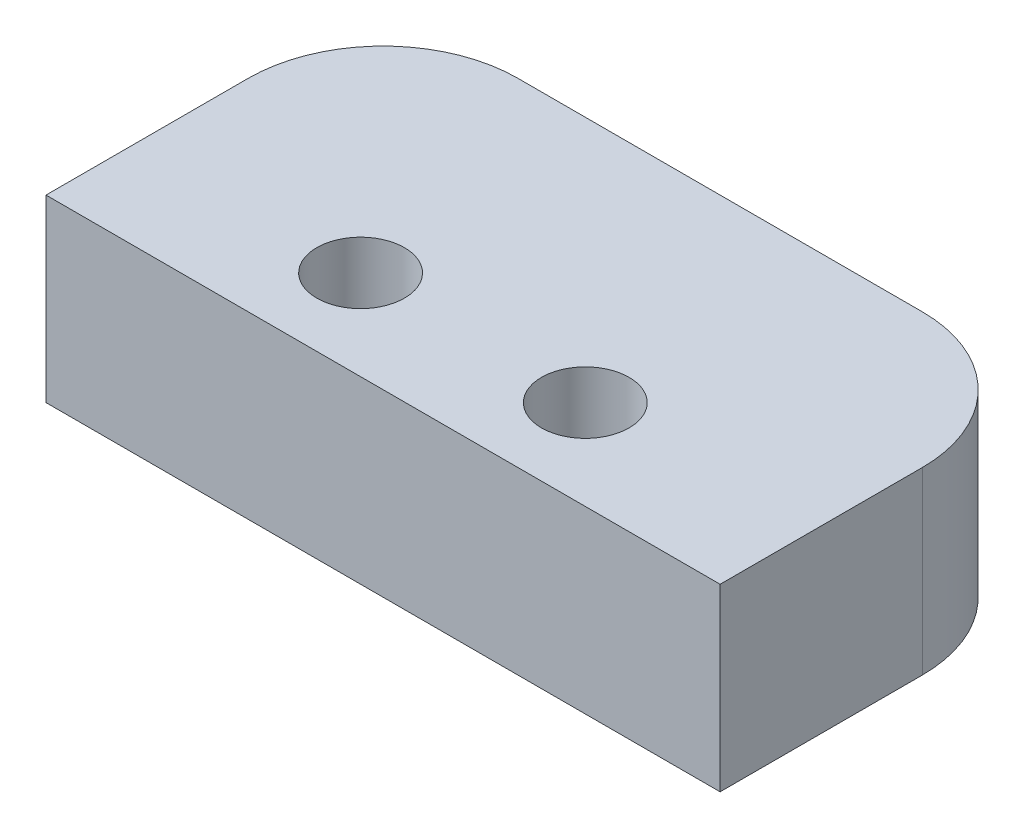
ISO-10303-21;
HEADER;
FILE_DESCRIPTION(('STEP AP214'),'2;1');
FILE_NAME('part.step','',(''),(''),'','','');
FILE_SCHEMA(('AUTOMOTIVE_DESIGN { 1 0 10303 214 1 1 1 1 }'));
ENDSEC;
DATA;
#1=APPLICATION_CONTEXT('core data for automotive mechanical design processes');
#2=APPLICATION_PROTOCOL_DEFINITION('international standard','automotive_design',2000,#1);
#3=PRODUCT_CONTEXT('',#1,'mechanical');
#4=PRODUCT('Part','Part','',(#3));
#5=PRODUCT_RELATED_PRODUCT_CATEGORY('part','',(#4));
#6=PRODUCT_DEFINITION_FORMATION('','',#4);
#7=PRODUCT_DEFINITION_CONTEXT('part definition',#1,'design');
#8=PRODUCT_DEFINITION('design','',#6,#7);
#9=PRODUCT_DEFINITION_SHAPE('','',#8);
#10=(LENGTH_UNIT() NAMED_UNIT(*) SI_UNIT(.MILLI.,.METRE.));
#11=(NAMED_UNIT(*) PLANE_ANGLE_UNIT() SI_UNIT($,.RADIAN.));
#12=(NAMED_UNIT(*) SI_UNIT($,.STERADIAN.) SOLID_ANGLE_UNIT());
#13=UNCERTAINTY_MEASURE_WITH_UNIT(LENGTH_MEASURE(1.E-05),#10,'distance_accuracy_value','');
#14=(GEOMETRIC_REPRESENTATION_CONTEXT(3) GLOBAL_UNCERTAINTY_ASSIGNED_CONTEXT((#13)) GLOBAL_UNIT_ASSIGNED_CONTEXT((#10,
#11,#12)) REPRESENTATION_CONTEXT('',''));
#15=CARTESIAN_POINT('',(0.,0.,0.));
#16=DIRECTION('',(0.,0.,1.));
#17=DIRECTION('',(1.,0.,0.));
#18=AXIS2_PLACEMENT_3D('',#15,#16,#17);
#19=CARTESIAN_POINT('',(-15.,8.,7.5));
#20=DIRECTION('',(1.,0.,0.));
#21=DIRECTION('',(0.,0.,-1.));
#22=AXIS2_PLACEMENT_3D('',#19,#20,#21);
#23=PLANE('',#22);
#24=DIRECTION('',(0.,0.,1.));
#25=VECTOR('',#24,1.);
#26=CARTESIAN_POINT('',(-15.,8.,7.5));
#27=LINE('',#26,#25);
#28=CARTESIAN_POINT('',(-15.,8.,-1.5));
#29=VERTEX_POINT('',#28);
#30=CARTESIAN_POINT('',(-15.,8.,7.5));
#31=VERTEX_POINT('',#30);
#32=EDGE_CURVE('E87',#29,#31,#27,.T.);
#33=ORIENTED_EDGE('',*,*,#32,.F.);
#34=DIRECTION('',(0.,-1.,0.));
#35=VECTOR('',#34,1.);
#36=CARTESIAN_POINT('',(-15.,8.,-1.5));
#37=LINE('',#36,#35);
#38=CARTESIAN_POINT('',(-15.,0.,-1.5));
#39=VERTEX_POINT('',#38);
#40=EDGE_CURVE('E110',#29,#39,#37,.T.);
#41=ORIENTED_EDGE('',*,*,#40,.T.);
#42=DIRECTION('',(0.,0.,1.));
#43=VECTOR('',#42,1.);
#44=CARTESIAN_POINT('',(-15.,0.,7.5));
#45=LINE('',#44,#43);
#46=CARTESIAN_POINT('',(-15.,0.,7.5));
#47=VERTEX_POINT('',#46);
#48=EDGE_CURVE('E108',#39,#47,#45,.T.);
#49=ORIENTED_EDGE('',*,*,#48,.T.);
#50=DIRECTION('',(0.,-1.,0.));
#51=VECTOR('',#50,1.);
#52=CARTESIAN_POINT('',(-15.,8.,7.5));
#53=LINE('',#52,#51);
#54=EDGE_CURVE('E102',#31,#47,#53,.T.);
#55=ORIENTED_EDGE('',*,*,#54,.F.);
#56=EDGE_LOOP('',(#33,#41,#49,#55));
#57=FACE_BOUND('',#56,.T.);
#58=ADVANCED_FACE('F33',(#57),#23,.F.);
#59=CARTESIAN_POINT('',(15.,8.,7.5));
#60=DIRECTION('',(0.,0.,-1.));
#61=DIRECTION('',(-1.,0.,0.));
#62=AXIS2_PLACEMENT_3D('',#59,#60,#61);
#63=PLANE('',#62);
#64=DIRECTION('',(1.,0.,0.));
#65=VECTOR('',#64,1.);
#66=CARTESIAN_POINT('',(15.,0.,7.5));
#67=LINE('',#66,#65);
#68=CARTESIAN_POINT('',(15.,0.,7.5));
#69=VERTEX_POINT('',#68);
#70=EDGE_CURVE('E137',#47,#69,#67,.T.);
#71=ORIENTED_EDGE('',*,*,#70,.T.);
#72=DIRECTION('',(0.,-1.,0.));
#73=VECTOR('',#72,1.);
#74=CARTESIAN_POINT('',(15.,8.,7.5));
#75=LINE('',#74,#73);
#76=CARTESIAN_POINT('',(15.,8.,7.5));
#77=VERTEX_POINT('',#76);
#78=EDGE_CURVE('E104',#77,#69,#75,.T.);
#79=ORIENTED_EDGE('',*,*,#78,.F.);
#80=DIRECTION('',(1.,0.,0.));
#81=VECTOR('',#80,1.);
#82=CARTESIAN_POINT('',(15.,8.,7.5));
#83=LINE('',#82,#81);
#84=EDGE_CURVE('E90',#31,#77,#83,.T.);
#85=ORIENTED_EDGE('',*,*,#84,.F.);
#86=ORIENTED_EDGE('',*,*,#54,.T.);
#87=EDGE_LOOP('',(#71,#79,#85,#86));
#88=FACE_BOUND('',#87,.T.);
#89=ADVANCED_FACE('F101',(#88),#63,.F.);
#90=CARTESIAN_POINT('',(15.,8.,7.5));
#91=DIRECTION('',(-1.,0.,0.));
#92=DIRECTION('',(0.,0.,1.));
#93=AXIS2_PLACEMENT_3D('',#90,#91,#92);
#94=PLANE('',#93);
#95=DIRECTION('',(0.,0.,-1.));
#96=VECTOR('',#95,1.);
#97=CARTESIAN_POINT('',(15.,0.,7.5));
#98=LINE('',#97,#96);
#99=CARTESIAN_POINT('',(15.,0.,-1.5));
#100=VERTEX_POINT('',#99);
#101=EDGE_CURVE('E135',#69,#100,#98,.T.);
#102=ORIENTED_EDGE('',*,*,#101,.T.);
#103=DIRECTION('',(0.,-1.,0.));
#104=VECTOR('',#103,1.);
#105=CARTESIAN_POINT('',(15.,8.,-1.5));
#106=LINE('',#105,#104);
#107=CARTESIAN_POINT('',(15.,8.,-1.5));
#108=VERTEX_POINT('',#107);
#109=EDGE_CURVE('E11',#100,#108,#106,.F.);
#110=ORIENTED_EDGE('',*,*,#109,.T.);
#111=DIRECTION('',(0.,0.,-1.));
#112=VECTOR('',#111,1.);
#113=CARTESIAN_POINT('',(15.,8.,7.5));
#114=LINE('',#113,#112);
#115=EDGE_CURVE('E105',#77,#108,#114,.T.);
#116=ORIENTED_EDGE('',*,*,#115,.F.);
#117=ORIENTED_EDGE('',*,*,#78,.T.);
#118=EDGE_LOOP('',(#102,#110,#116,#117));
#119=FACE_BOUND('',#118,.T.);
#120=ADVANCED_FACE('F136',(#119),#94,.F.);
#121=CARTESIAN_POINT('',(15.,8.,-7.5));
#122=DIRECTION('',(0.,0.,1.));
#123=DIRECTION('',(1.,0.,0.));
#124=AXIS2_PLACEMENT_3D('',#121,#122,#123);
#125=PLANE('',#124);
#126=DIRECTION('',(-1.,0.,0.));
#127=VECTOR('',#126,1.);
#128=CARTESIAN_POINT('',(15.,0.,-7.5));
#129=LINE('',#128,#127);
#130=CARTESIAN_POINT('',(9.,0.,-7.5));
#131=VERTEX_POINT('',#130);
#132=CARTESIAN_POINT('',(-9.,0.,-7.5));
#133=VERTEX_POINT('',#132);
#134=EDGE_CURVE('E97',#131,#133,#129,.T.);
#135=ORIENTED_EDGE('',*,*,#134,.T.);
#136=DIRECTION('',(0.,-1.,0.));
#137=VECTOR('',#136,1.);
#138=CARTESIAN_POINT('',(-9.,8.,-7.5));
#139=LINE('',#138,#137);
#140=CARTESIAN_POINT('',(-9.,8.,-7.5));
#141=VERTEX_POINT('',#140);
#142=EDGE_CURVE('E54',#133,#141,#139,.F.);
#143=ORIENTED_EDGE('',*,*,#142,.T.);
#144=DIRECTION('',(-1.,0.,0.));
#145=VECTOR('',#144,1.);
#146=CARTESIAN_POINT('',(15.,8.,-7.5));
#147=LINE('',#146,#145);
#148=CARTESIAN_POINT('',(9.,8.,-7.5));
#149=VERTEX_POINT('',#148);
#150=EDGE_CURVE('E114',#149,#141,#147,.T.);
#151=ORIENTED_EDGE('',*,*,#150,.F.);
#152=DIRECTION('',(0.,-1.,0.));
#153=VECTOR('',#152,1.);
#154=CARTESIAN_POINT('',(9.,8.,-7.5));
#155=LINE('',#154,#153);
#156=EDGE_CURVE('E121',#149,#131,#155,.T.);
#157=ORIENTED_EDGE('',*,*,#156,.T.);
#158=EDGE_LOOP('',(#135,#143,#151,#157));
#159=FACE_BOUND('',#158,.T.);
#160=ADVANCED_FACE('F129',(#159),#125,.F.);
#161=CARTESIAN_POINT('',(0.,8.,0.));
#162=DIRECTION('',(0.,1.,0.));
#163=DIRECTION('',(0.,0.,1.));
#164=AXIS2_PLACEMENT_3D('',#161,#162,#163);
#165=PLANE('',#164);
#166=CARTESIAN_POINT('',(-5.,8.,3.5));
#167=DIRECTION('',(0.,1.,0.));
#168=DIRECTION('',(0.,0.,1.));
#169=AXIS2_PLACEMENT_3D('',#166,#167,#168);
#170=CIRCLE('',#169,1.95);
#171=CARTESIAN_POINT('',(-5.,8.,5.45));
#172=VERTEX_POINT('',#171);
#173=EDGE_CURVE('E150',#172,#172,#170,.T.);
#174=ORIENTED_EDGE('',*,*,#173,.F.);
#175=EDGE_LOOP('',(#174));
#176=FACE_BOUND('',#175,.T.);
#177=CARTESIAN_POINT('',(5.,8.,3.5));
#178=DIRECTION('',(0.,1.,0.));
#179=DIRECTION('',(0.,0.,1.));
#180=AXIS2_PLACEMENT_3D('',#177,#178,#179);
#181=CIRCLE('',#180,1.95);
#182=CARTESIAN_POINT('',(5.,8.,5.45));
#183=VERTEX_POINT('',#182);
#184=EDGE_CURVE('E144',#183,#183,#181,.T.);
#185=ORIENTED_EDGE('',*,*,#184,.F.);
#186=EDGE_LOOP('',(#185));
#187=FACE_BOUND('',#186,.T.);
#188=ORIENTED_EDGE('',*,*,#150,.T.);
#189=CARTESIAN_POINT('',(-9.,8.,-1.5));
#190=DIRECTION('',(0.,1.,0.));
#191=DIRECTION('',(0.,0.,1.));
#192=AXIS2_PLACEMENT_3D('',#189,#190,#191);
#193=CIRCLE('',#192,6.);
#194=EDGE_CURVE('E41',#141,#29,#193,.T.);
#195=ORIENTED_EDGE('',*,*,#194,.T.);
#196=ORIENTED_EDGE('',*,*,#32,.T.);
#197=ORIENTED_EDGE('',*,*,#84,.T.);
#198=ORIENTED_EDGE('',*,*,#115,.T.);
#199=CARTESIAN_POINT('',(9.,8.,-1.5));
#200=DIRECTION('',(0.,1.,0.));
#201=DIRECTION('',(0.,0.,1.));
#202=AXIS2_PLACEMENT_3D('',#199,#200,#201);
#203=CIRCLE('',#202,6.);
#204=EDGE_CURVE('E125',#108,#149,#203,.T.);
#205=ORIENTED_EDGE('',*,*,#204,.T.);
#206=EDGE_LOOP('',(#188,#195,#196,#197,#198,#205));
#207=FACE_BOUND('',#206,.T.);
#208=ADVANCED_FACE('F89',(#176,#187,#207),#165,.T.);
#209=CARTESIAN_POINT('',(0.,0.,0.));
#210=DIRECTION('',(0.,1.,0.));
#211=DIRECTION('',(0.,0.,1.));
#212=AXIS2_PLACEMENT_3D('',#209,#210,#211);
#213=PLANE('',#212);
#214=CARTESIAN_POINT('',(-5.,0.,3.5));
#215=DIRECTION('',(0.,1.,0.));
#216=DIRECTION('',(0.,0.,1.));
#217=AXIS2_PLACEMENT_3D('',#214,#215,#216);
#218=CIRCLE('',#217,1.95);
#219=CARTESIAN_POINT('',(-5.,0.,5.45));
#220=VERTEX_POINT('',#219);
#221=EDGE_CURVE('E141',#220,#220,#218,.T.);
#222=ORIENTED_EDGE('',*,*,#221,.T.);
#223=EDGE_LOOP('',(#222));
#224=FACE_BOUND('',#223,.T.);
#225=CARTESIAN_POINT('',(5.,0.,3.5));
#226=DIRECTION('',(0.,1.,0.));
#227=DIRECTION('',(0.,0.,1.));
#228=AXIS2_PLACEMENT_3D('',#225,#226,#227);
#229=CIRCLE('',#228,1.95);
#230=CARTESIAN_POINT('',(5.,0.,5.45));
#231=VERTEX_POINT('',#230);
#232=EDGE_CURVE('E147',#231,#231,#229,.T.);
#233=ORIENTED_EDGE('',*,*,#232,.T.);
#234=EDGE_LOOP('',(#233));
#235=FACE_BOUND('',#234,.T.);
#236=ORIENTED_EDGE('',*,*,#48,.F.);
#237=CARTESIAN_POINT('',(-9.,0.,-1.5));
#238=DIRECTION('',(0.,1.,0.));
#239=DIRECTION('',(0.,0.,1.));
#240=AXIS2_PLACEMENT_3D('',#237,#238,#239);
#241=CIRCLE('',#240,6.);
#242=EDGE_CURVE('E119',#39,#133,#241,.F.);
#243=ORIENTED_EDGE('',*,*,#242,.T.);
#244=ORIENTED_EDGE('',*,*,#134,.F.);
#245=CARTESIAN_POINT('',(9.,0.,-1.5));
#246=DIRECTION('',(0.,1.,0.));
#247=DIRECTION('',(0.,0.,1.));
#248=AXIS2_PLACEMENT_3D('',#245,#246,#247);
#249=CIRCLE('',#248,6.);
#250=EDGE_CURVE('E112',#131,#100,#249,.F.);
#251=ORIENTED_EDGE('',*,*,#250,.T.);
#252=ORIENTED_EDGE('',*,*,#101,.F.);
#253=ORIENTED_EDGE('',*,*,#70,.F.);
#254=EDGE_LOOP('',(#236,#243,#244,#251,#252,#253));
#255=FACE_BOUND('',#254,.T.);
#256=ADVANCED_FACE('F134',(#224,#235,#255),#213,.F.);
#257=CARTESIAN_POINT('',(-9.,8.,-1.5));
#258=DIRECTION('',(0.,-1.,0.));
#259=DIRECTION('',(0.,0.,-1.));
#260=AXIS2_PLACEMENT_3D('',#257,#258,#259);
#261=CYLINDRICAL_SURFACE('',#260,6.);
#262=ORIENTED_EDGE('',*,*,#194,.F.);
#263=ORIENTED_EDGE('',*,*,#142,.F.);
#264=ORIENTED_EDGE('',*,*,#242,.F.);
#265=ORIENTED_EDGE('',*,*,#40,.F.);
#266=EDGE_LOOP('',(#262,#263,#264,#265));
#267=FACE_BOUND('',#266,.T.);
#268=ADVANCED_FACE('F176',(#267),#261,.T.);
#269=CARTESIAN_POINT('',(9.,8.,-1.5));
#270=DIRECTION('',(0.,-1.,0.));
#271=DIRECTION('',(0.,0.,-1.));
#272=AXIS2_PLACEMENT_3D('',#269,#270,#271);
#273=CYLINDRICAL_SURFACE('',#272,6.);
#274=ORIENTED_EDGE('',*,*,#204,.F.);
#275=ORIENTED_EDGE('',*,*,#109,.F.);
#276=ORIENTED_EDGE('',*,*,#250,.F.);
#277=ORIENTED_EDGE('',*,*,#156,.F.);
#278=EDGE_LOOP('',(#274,#275,#276,#277));
#279=FACE_BOUND('',#278,.T.);
#280=ADVANCED_FACE('F35',(#279),#273,.T.);
#281=CARTESIAN_POINT('',(5.,0.,3.5));
#282=DIRECTION('',(0.,1.,0.));
#283=DIRECTION('',(0.,0.,1.));
#284=AXIS2_PLACEMENT_3D('',#281,#282,#283);
#285=CYLINDRICAL_SURFACE('',#284,1.95);
#286=ORIENTED_EDGE('',*,*,#232,.F.);
#287=EDGE_LOOP('',(#286));
#288=FACE_BOUND('',#287,.T.);
#289=ORIENTED_EDGE('',*,*,#184,.T.);
#290=EDGE_LOOP('',(#289));
#291=FACE_BOUND('',#290,.T.);
#292=ADVANCED_FACE('F161',(#288,#291),#285,.F.);
#293=CARTESIAN_POINT('',(-5.,0.,3.5));
#294=DIRECTION('',(0.,1.,0.));
#295=DIRECTION('',(0.,0.,1.));
#296=AXIS2_PLACEMENT_3D('',#293,#294,#295);
#297=CYLINDRICAL_SURFACE('',#296,1.95);
#298=ORIENTED_EDGE('',*,*,#221,.F.);
#299=EDGE_LOOP('',(#298));
#300=FACE_BOUND('',#299,.T.);
#301=ORIENTED_EDGE('',*,*,#173,.T.);
#302=EDGE_LOOP('',(#301));
#303=FACE_BOUND('',#302,.T.);
#304=ADVANCED_FACE('F158',(#300,#303),#297,.F.);
#305=CLOSED_SHELL('',(#58,#89,#120,#160,#208,#256,#268,#280,#292,#304));
#306=MANIFOLD_SOLID_BREP('B2',#305);
#307=ADVANCED_BREP_SHAPE_REPRESENTATION('',(#18,#306),#14);
#308=SHAPE_DEFINITION_REPRESENTATION(#9,#307);
ENDSEC;
END-ISO-10303-21;
